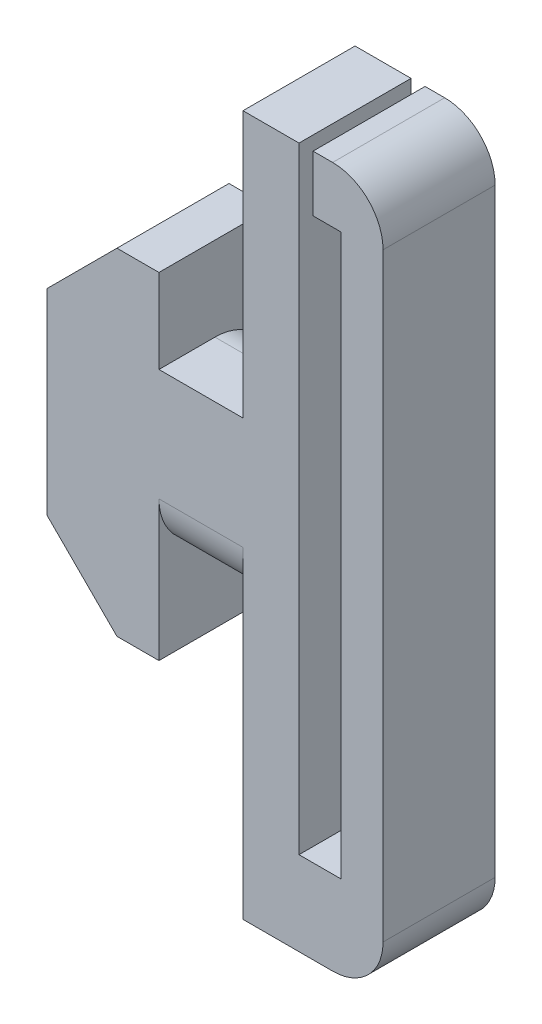
ISO-10303-21;
HEADER;
FILE_DESCRIPTION(('STEP AP214'),'2;1');
FILE_NAME('part.step','',(''),(''),'','','');
FILE_SCHEMA(('AUTOMOTIVE_DESIGN { 1 0 10303 214 1 1 1 1 }'));
ENDSEC;
DATA;
#1=APPLICATION_CONTEXT('core data for automotive mechanical design processes');
#2=APPLICATION_PROTOCOL_DEFINITION('international standard','automotive_design',2000,#1);
#3=PRODUCT_CONTEXT('',#1,'mechanical');
#4=PRODUCT('Part','Part','',(#3));
#5=PRODUCT_RELATED_PRODUCT_CATEGORY('part','',(#4));
#6=PRODUCT_DEFINITION_FORMATION('','',#4);
#7=PRODUCT_DEFINITION_CONTEXT('part definition',#1,'design');
#8=PRODUCT_DEFINITION('design','',#6,#7);
#9=PRODUCT_DEFINITION_SHAPE('','',#8);
#10=(LENGTH_UNIT() NAMED_UNIT(*) SI_UNIT(.MILLI.,.METRE.));
#11=(NAMED_UNIT(*) PLANE_ANGLE_UNIT() SI_UNIT($,.RADIAN.));
#12=(NAMED_UNIT(*) SI_UNIT($,.STERADIAN.) SOLID_ANGLE_UNIT());
#13=UNCERTAINTY_MEASURE_WITH_UNIT(LENGTH_MEASURE(1.E-05),#10,'distance_accuracy_value','');
#14=(GEOMETRIC_REPRESENTATION_CONTEXT(3) GLOBAL_UNCERTAINTY_ASSIGNED_CONTEXT((#13)) GLOBAL_UNIT_ASSIGNED_CONTEXT((#10,
#11,#12)) REPRESENTATION_CONTEXT('',''));
#15=CARTESIAN_POINT('',(0.,0.,0.));
#16=DIRECTION('',(0.,0.,1.));
#17=DIRECTION('',(1.,0.,0.));
#18=AXIS2_PLACEMENT_3D('',#15,#16,#17);
#19=CARTESIAN_POINT('',(0.,0.,4.));
#20=DIRECTION('',(1.,0.,0.));
#21=DIRECTION('',(0.,0.,-1.));
#22=AXIS2_PLACEMENT_3D('',#19,#20,#21);
#23=PLANE('',#22);
#24=DIRECTION('',(0.,0.,1.));
#25=VECTOR('',#24,1.);
#26=CARTESIAN_POINT('',(0.,9.5,0.));
#27=LINE('',#26,#25);
#28=CARTESIAN_POINT('',(0.,9.5,0.));
#29=VERTEX_POINT('',#28);
#30=CARTESIAN_POINT('',(0.,9.5,2.));
#31=VERTEX_POINT('',#30);
#32=EDGE_CURVE('E255',#29,#31,#27,.T.);
#33=ORIENTED_EDGE('',*,*,#32,.F.);
#34=DIRECTION('',(0.,-1.,0.));
#35=VECTOR('',#34,1.);
#36=CARTESIAN_POINT('',(0.,0.,0.));
#37=LINE('',#36,#35);
#38=CARTESIAN_POINT('',(0.,0.,0.));
#39=VERTEX_POINT('',#38);
#40=EDGE_CURVE('E334',#29,#39,#37,.T.);
#41=ORIENTED_EDGE('',*,*,#40,.T.);
#42=DIRECTION('',(0.,0.,-1.));
#43=VECTOR('',#42,1.);
#44=CARTESIAN_POINT('',(0.,0.,4.));
#45=LINE('',#44,#43);
#46=CARTESIAN_POINT('',(0.,0.,4.));
#47=VERTEX_POINT('',#46);
#48=EDGE_CURVE('E305',#47,#39,#45,.T.);
#49=ORIENTED_EDGE('',*,*,#48,.F.);
#50=DIRECTION('',(0.,-1.,0.));
#51=VECTOR('',#50,1.);
#52=CARTESIAN_POINT('',(0.,0.,4.));
#53=LINE('',#52,#51);
#54=CARTESIAN_POINT('',(0.,11.5,4.));
#55=VERTEX_POINT('',#54);
#56=EDGE_CURVE('E300',#55,#47,#53,.T.);
#57=ORIENTED_EDGE('',*,*,#56,.F.);
#58=CARTESIAN_POINT('',(0.,11.5,2.));
#59=DIRECTION('',(1.,0.,0.));
#60=DIRECTION('',(0.,0.,-1.));
#61=AXIS2_PLACEMENT_3D('',#58,#59,#60);
#62=CIRCLE('',#61,2.);
#63=EDGE_CURVE('E415',#55,#31,#62,.T.);
#64=ORIENTED_EDGE('',*,*,#63,.T.);
#65=EDGE_LOOP('',(#33,#41,#49,#57,#64));
#66=FACE_BOUND('',#65,.T.);
#67=ADVANCED_FACE('F39',(#66),#23,.F.);
#68=CARTESIAN_POINT('',(5.,0.,4.));
#69=DIRECTION('',(0.,1.,0.));
#70=DIRECTION('',(0.,0.,1.));
#71=AXIS2_PLACEMENT_3D('',#68,#69,#70);
#72=PLANE('',#71);
#73=DIRECTION('',(1.,0.,0.));
#74=VECTOR('',#73,1.);
#75=CARTESIAN_POINT('',(5.,0.,0.));
#76=LINE('',#75,#74);
#77=CARTESIAN_POINT('',(3.2,0.,0.));
#78=VERTEX_POINT('',#77);
#79=EDGE_CURVE('E266',#39,#78,#76,.T.);
#80=ORIENTED_EDGE('',*,*,#79,.T.);
#81=DIRECTION('',(0.,0.,-1.));
#82=VECTOR('',#81,1.);
#83=CARTESIAN_POINT('',(3.2,0.,4.));
#84=LINE('',#83,#82);
#85=CARTESIAN_POINT('',(3.2,0.,4.));
#86=VERTEX_POINT('',#85);
#87=EDGE_CURVE('E391',#78,#86,#84,.F.);
#88=ORIENTED_EDGE('',*,*,#87,.T.);
#89=DIRECTION('',(1.,0.,0.));
#90=VECTOR('',#89,1.);
#91=CARTESIAN_POINT('',(5.,0.,4.));
#92=LINE('',#91,#90);
#93=EDGE_CURVE('E270',#47,#86,#92,.T.);
#94=ORIENTED_EDGE('',*,*,#93,.F.);
#95=ORIENTED_EDGE('',*,*,#48,.T.);
#96=EDGE_LOOP('',(#80,#88,#94,#95));
#97=FACE_BOUND('',#96,.T.);
#98=ADVANCED_FACE('F464',(#97),#72,.F.);
#99=CARTESIAN_POINT('',(5.,25.,4.));
#100=DIRECTION('',(-1.,0.,0.));
#101=DIRECTION('',(0.,-1.,0.));
#102=AXIS2_PLACEMENT_3D('',#99,#100,#101);
#103=PLANE('',#102);
#104=DIRECTION('',(0.,1.,0.));
#105=VECTOR('',#104,1.);
#106=CARTESIAN_POINT('',(5.,25.,0.));
#107=LINE('',#106,#105);
#108=CARTESIAN_POINT('',(5.,1.8,0.));
#109=VERTEX_POINT('',#108);
#110=CARTESIAN_POINT('',(5.,23.2,0.));
#111=VERTEX_POINT('',#110);
#112=EDGE_CURVE('E309',#109,#111,#107,.T.);
#113=ORIENTED_EDGE('',*,*,#112,.T.);
#114=DIRECTION('',(0.,0.,-1.));
#115=VECTOR('',#114,1.);
#116=CARTESIAN_POINT('',(5.,23.2,4.));
#117=LINE('',#116,#115);
#118=CARTESIAN_POINT('',(5.,23.2,4.));
#119=VERTEX_POINT('',#118);
#120=EDGE_CURVE('E382',#111,#119,#117,.F.);
#121=ORIENTED_EDGE('',*,*,#120,.T.);
#122=DIRECTION('',(0.,1.,0.));
#123=VECTOR('',#122,1.);
#124=CARTESIAN_POINT('',(5.,25.,4.));
#125=LINE('',#124,#123);
#126=CARTESIAN_POINT('',(5.,1.8,4.));
#127=VERTEX_POINT('',#126);
#128=EDGE_CURVE('E274',#127,#119,#125,.T.);
#129=ORIENTED_EDGE('',*,*,#128,.F.);
#130=DIRECTION('',(0.,0.,-1.));
#131=VECTOR('',#130,1.);
#132=CARTESIAN_POINT('',(5.,1.8,4.));
#133=LINE('',#132,#131);
#134=EDGE_CURVE('E378',#127,#109,#133,.T.);
#135=ORIENTED_EDGE('',*,*,#134,.T.);
#136=EDGE_LOOP('',(#113,#121,#129,#135));
#137=FACE_BOUND('',#136,.T.);
#138=ADVANCED_FACE('F472',(#137),#103,.F.);
#139=CARTESIAN_POINT('',(2.5,25.,4.));
#140=DIRECTION('',(0.,-1.,0.));
#141=DIRECTION('',(0.,0.,-1.));
#142=AXIS2_PLACEMENT_3D('',#139,#140,#141);
#143=PLANE('',#142);
#144=DIRECTION('',(-1.,0.,0.));
#145=VECTOR('',#144,1.);
#146=CARTESIAN_POINT('',(2.5,25.,4.));
#147=LINE('',#146,#145);
#148=CARTESIAN_POINT('',(3.2,25.,4.));
#149=VERTEX_POINT('',#148);
#150=CARTESIAN_POINT('',(2.5,25.,4.));
#151=VERTEX_POINT('',#150);
#152=EDGE_CURVE('E279',#149,#151,#147,.T.);
#153=ORIENTED_EDGE('',*,*,#152,.F.);
#154=DIRECTION('',(0.,0.,-1.));
#155=VECTOR('',#154,1.);
#156=CARTESIAN_POINT('',(3.2,25.,4.));
#157=LINE('',#156,#155);
#158=CARTESIAN_POINT('',(3.2,25.,0.));
#159=VERTEX_POINT('',#158);
#160=EDGE_CURVE('E368',#149,#159,#157,.T.);
#161=ORIENTED_EDGE('',*,*,#160,.T.);
#162=DIRECTION('',(-1.,0.,0.));
#163=VECTOR('',#162,1.);
#164=CARTESIAN_POINT('',(2.5,25.,0.));
#165=LINE('',#164,#163);
#166=CARTESIAN_POINT('',(2.5,25.,0.));
#167=VERTEX_POINT('',#166);
#168=EDGE_CURVE('E313',#159,#167,#165,.T.);
#169=ORIENTED_EDGE('',*,*,#168,.T.);
#170=DIRECTION('',(0.,0.,-1.));
#171=VECTOR('',#170,1.);
#172=CARTESIAN_POINT('',(2.5,25.,4.));
#173=LINE('',#172,#171);
#174=EDGE_CURVE('E364',#151,#167,#173,.T.);
#175=ORIENTED_EDGE('',*,*,#174,.F.);
#176=EDGE_LOOP('',(#153,#161,#169,#175));
#177=FACE_BOUND('',#176,.T.);
#178=ADVANCED_FACE('F481',(#177),#143,.F.);
#179=CARTESIAN_POINT('',(2.5,23.,4.));
#180=DIRECTION('',(1.,0.,0.));
#181=DIRECTION('',(0.,0.,-1.));
#182=AXIS2_PLACEMENT_3D('',#179,#180,#181);
#183=PLANE('',#182);
#184=DIRECTION('',(0.,-1.,0.));
#185=VECTOR('',#184,1.);
#186=CARTESIAN_POINT('',(2.5,23.,0.));
#187=LINE('',#186,#185);
#188=CARTESIAN_POINT('',(2.5,23.,0.));
#189=VERTEX_POINT('',#188);
#190=EDGE_CURVE('E316',#167,#189,#187,.T.);
#191=ORIENTED_EDGE('',*,*,#190,.T.);
#192=DIRECTION('',(0.,0.,-1.));
#193=VECTOR('',#192,1.);
#194=CARTESIAN_POINT('',(2.5,23.,4.));
#195=LINE('',#194,#193);
#196=CARTESIAN_POINT('',(2.5,23.,4.));
#197=VERTEX_POINT('',#196);
#198=EDGE_CURVE('E360',#197,#189,#195,.T.);
#199=ORIENTED_EDGE('',*,*,#198,.F.);
#200=DIRECTION('',(0.,-1.,0.));
#201=VECTOR('',#200,1.);
#202=CARTESIAN_POINT('',(2.5,23.,4.));
#203=LINE('',#202,#201);
#204=EDGE_CURVE('E282',#151,#197,#203,.T.);
#205=ORIENTED_EDGE('',*,*,#204,.F.);
#206=ORIENTED_EDGE('',*,*,#174,.T.);
#207=EDGE_LOOP('',(#191,#199,#205,#206));
#208=FACE_BOUND('',#207,.T.);
#209=ADVANCED_FACE('F487',(#208),#183,.F.);
#210=CARTESIAN_POINT('',(3.5,23.,4.));
#211=DIRECTION('',(0.,1.,0.));
#212=DIRECTION('',(0.,0.,1.));
#213=AXIS2_PLACEMENT_3D('',#210,#211,#212);
#214=PLANE('',#213);
#215=DIRECTION('',(1.,0.,0.));
#216=VECTOR('',#215,1.);
#217=CARTESIAN_POINT('',(3.5,23.,0.));
#218=LINE('',#217,#216);
#219=CARTESIAN_POINT('',(3.5,23.,0.));
#220=VERTEX_POINT('',#219);
#221=EDGE_CURVE('E319',#189,#220,#218,.T.);
#222=ORIENTED_EDGE('',*,*,#221,.T.);
#223=DIRECTION('',(0.,0.,-1.));
#224=VECTOR('',#223,1.);
#225=CARTESIAN_POINT('',(3.5,23.,4.));
#226=LINE('',#225,#224);
#227=CARTESIAN_POINT('',(3.5,23.,4.));
#228=VERTEX_POINT('',#227);
#229=EDGE_CURVE('E356',#228,#220,#226,.T.);
#230=ORIENTED_EDGE('',*,*,#229,.F.);
#231=DIRECTION('',(1.,0.,0.));
#232=VECTOR('',#231,1.);
#233=CARTESIAN_POINT('',(3.5,23.,4.));
#234=LINE('',#233,#232);
#235=EDGE_CURVE('E285',#197,#228,#234,.T.);
#236=ORIENTED_EDGE('',*,*,#235,.F.);
#237=ORIENTED_EDGE('',*,*,#198,.T.);
#238=EDGE_LOOP('',(#222,#230,#236,#237));
#239=FACE_BOUND('',#238,.T.);
#240=ADVANCED_FACE('F493',(#239),#214,.F.);
#241=CARTESIAN_POINT('',(3.5,3.,4.));
#242=DIRECTION('',(1.,0.,0.));
#243=DIRECTION('',(0.,0.,-1.));
#244=AXIS2_PLACEMENT_3D('',#241,#242,#243);
#245=PLANE('',#244);
#246=DIRECTION('',(0.,-1.,0.));
#247=VECTOR('',#246,1.);
#248=CARTESIAN_POINT('',(3.5,3.,0.));
#249=LINE('',#248,#247);
#250=CARTESIAN_POINT('',(3.5,3.,0.));
#251=VERTEX_POINT('',#250);
#252=EDGE_CURVE('E322',#220,#251,#249,.T.);
#253=ORIENTED_EDGE('',*,*,#252,.T.);
#254=DIRECTION('',(0.,0.,-1.));
#255=VECTOR('',#254,1.);
#256=CARTESIAN_POINT('',(3.5,3.,4.));
#257=LINE('',#256,#255);
#258=CARTESIAN_POINT('',(3.5,3.,4.));
#259=VERTEX_POINT('',#258);
#260=EDGE_CURVE('E352',#259,#251,#257,.T.);
#261=ORIENTED_EDGE('',*,*,#260,.F.);
#262=DIRECTION('',(0.,-1.,0.));
#263=VECTOR('',#262,1.);
#264=CARTESIAN_POINT('',(3.5,3.,4.));
#265=LINE('',#264,#263);
#266=EDGE_CURVE('E288',#228,#259,#265,.T.);
#267=ORIENTED_EDGE('',*,*,#266,.F.);
#268=ORIENTED_EDGE('',*,*,#229,.T.);
#269=EDGE_LOOP('',(#253,#261,#267,#268));
#270=FACE_BOUND('',#269,.T.);
#271=ADVANCED_FACE('F497',(#270),#245,.F.);
#272=CARTESIAN_POINT('',(2.,3.,4.));
#273=DIRECTION('',(0.,-1.,0.));
#274=DIRECTION('',(0.,0.,-1.));
#275=AXIS2_PLACEMENT_3D('',#272,#273,#274);
#276=PLANE('',#275);
#277=DIRECTION('',(-1.,0.,0.));
#278=VECTOR('',#277,1.);
#279=CARTESIAN_POINT('',(2.,3.,0.));
#280=LINE('',#279,#278);
#281=CARTESIAN_POINT('',(2.,3.,0.));
#282=VERTEX_POINT('',#281);
#283=EDGE_CURVE('E325',#251,#282,#280,.T.);
#284=ORIENTED_EDGE('',*,*,#283,.T.);
#285=DIRECTION('',(0.,0.,-1.));
#286=VECTOR('',#285,1.);
#287=CARTESIAN_POINT('',(2.,3.,4.));
#288=LINE('',#287,#286);
#289=CARTESIAN_POINT('',(2.,3.,4.));
#290=VERTEX_POINT('',#289);
#291=EDGE_CURVE('E348',#290,#282,#288,.T.);
#292=ORIENTED_EDGE('',*,*,#291,.F.);
#293=DIRECTION('',(-1.,0.,0.));
#294=VECTOR('',#293,1.);
#295=CARTESIAN_POINT('',(2.,3.,4.));
#296=LINE('',#295,#294);
#297=EDGE_CURVE('E291',#259,#290,#296,.T.);
#298=ORIENTED_EDGE('',*,*,#297,.F.);
#299=ORIENTED_EDGE('',*,*,#260,.T.);
#300=EDGE_LOOP('',(#284,#292,#298,#299));
#301=FACE_BOUND('',#300,.T.);
#302=ADVANCED_FACE('F502',(#301),#276,.F.);
#303=CARTESIAN_POINT('',(2.,25.,4.));
#304=DIRECTION('',(-1.,0.,0.));
#305=DIRECTION('',(0.,-1.,0.));
#306=AXIS2_PLACEMENT_3D('',#303,#304,#305);
#307=PLANE('',#306);
#308=DIRECTION('',(0.,1.,0.));
#309=VECTOR('',#308,1.);
#310=CARTESIAN_POINT('',(2.,25.,0.));
#311=LINE('',#310,#309);
#312=CARTESIAN_POINT('',(2.,25.,0.));
#313=VERTEX_POINT('',#312);
#314=EDGE_CURVE('E328',#282,#313,#311,.T.);
#315=ORIENTED_EDGE('',*,*,#314,.T.);
#316=DIRECTION('',(0.,0.,-1.));
#317=VECTOR('',#316,1.);
#318=CARTESIAN_POINT('',(2.,25.,4.));
#319=LINE('',#318,#317);
#320=CARTESIAN_POINT('',(2.,25.,4.));
#321=VERTEX_POINT('',#320);
#322=EDGE_CURVE('E344',#321,#313,#319,.T.);
#323=ORIENTED_EDGE('',*,*,#322,.F.);
#324=DIRECTION('',(0.,1.,0.));
#325=VECTOR('',#324,1.);
#326=CARTESIAN_POINT('',(2.,25.,4.));
#327=LINE('',#326,#325);
#328=EDGE_CURVE('E294',#290,#321,#327,.T.);
#329=ORIENTED_EDGE('',*,*,#328,.F.);
#330=ORIENTED_EDGE('',*,*,#291,.T.);
#331=EDGE_LOOP('',(#315,#323,#329,#330));
#332=FACE_BOUND('',#331,.T.);
#333=ADVANCED_FACE('F508',(#332),#307,.F.);
#334=CARTESIAN_POINT('',(0.,25.,4.));
#335=DIRECTION('',(0.,-1.,0.));
#336=DIRECTION('',(0.,0.,-1.));
#337=AXIS2_PLACEMENT_3D('',#334,#335,#336);
#338=PLANE('',#337);
#339=DIRECTION('',(-1.,0.,0.));
#340=VECTOR('',#339,1.);
#341=CARTESIAN_POINT('',(0.,25.,0.));
#342=LINE('',#341,#340);
#343=CARTESIAN_POINT('',(0.,25.,0.));
#344=VERTEX_POINT('',#343);
#345=EDGE_CURVE('E331',#313,#344,#342,.T.);
#346=ORIENTED_EDGE('',*,*,#345,.T.);
#347=DIRECTION('',(0.,0.,-1.));
#348=VECTOR('',#347,1.);
#349=CARTESIAN_POINT('',(0.,25.,4.));
#350=LINE('',#349,#348);
#351=CARTESIAN_POINT('',(0.,25.,4.));
#352=VERTEX_POINT('',#351);
#353=EDGE_CURVE('E340',#352,#344,#350,.T.);
#354=ORIENTED_EDGE('',*,*,#353,.F.);
#355=DIRECTION('',(-1.,0.,0.));
#356=VECTOR('',#355,1.);
#357=CARTESIAN_POINT('',(0.,25.,4.));
#358=LINE('',#357,#356);
#359=EDGE_CURVE('E297',#321,#352,#358,.T.);
#360=ORIENTED_EDGE('',*,*,#359,.F.);
#361=ORIENTED_EDGE('',*,*,#322,.T.);
#362=EDGE_LOOP('',(#346,#354,#360,#361));
#363=FACE_BOUND('',#362,.T.);
#364=ADVANCED_FACE('F512',(#363),#338,.F.);
#365=CARTESIAN_POINT('',(0.,13.5,0.));
#366=VERTEX_POINT('',#365);
#367=EDGE_CURVE('E275',#344,#366,#37,.T.);
#368=ORIENTED_EDGE('',*,*,#367,.T.);
#369=CARTESIAN_POINT('',(0.,13.5,2.));
#370=DIRECTION('',(1.,0.,0.));
#371=DIRECTION('',(0.,0.,-1.));
#372=AXIS2_PLACEMENT_3D('',#369,#370,#371);
#373=CIRCLE('',#372,2.);
#374=CARTESIAN_POINT('',(0.,15.5,2.));
#375=VERTEX_POINT('',#374);
#376=EDGE_CURVE('E418',#366,#375,#373,.T.);
#377=ORIENTED_EDGE('',*,*,#376,.T.);
#378=DIRECTION('',(0.,0.,1.));
#379=VECTOR('',#378,1.);
#380=CARTESIAN_POINT('',(0.,15.5,0.));
#381=LINE('',#380,#379);
#382=CARTESIAN_POINT('',(0.,15.5,4.));
#383=VERTEX_POINT('',#382);
#384=EDGE_CURVE('E207',#375,#383,#381,.T.);
#385=ORIENTED_EDGE('',*,*,#384,.T.);
#386=EDGE_CURVE('E301',#352,#383,#53,.T.);
#387=ORIENTED_EDGE('',*,*,#386,.F.);
#388=ORIENTED_EDGE('',*,*,#353,.T.);
#389=EDGE_LOOP('',(#368,#377,#385,#387,#388));
#390=FACE_BOUND('',#389,.T.);
#391=ADVANCED_FACE('F516',(#390),#23,.F.);
#392=CARTESIAN_POINT('',(0.,0.,4.));
#393=DIRECTION('',(0.,0.,-1.));
#394=DIRECTION('',(-1.,0.,0.));
#395=AXIS2_PLACEMENT_3D('',#392,#393,#394);
#396=PLANE('',#395);
#397=DIRECTION('',(0.,1.,0.));
#398=VECTOR('',#397,1.);
#399=CARTESIAN_POINT('',(-7.,6.5,4.));
#400=LINE('',#399,#398);
#401=CARTESIAN_POINT('',(-7.,9.,4.));
#402=VERTEX_POINT('',#401);
#403=CARTESIAN_POINT('',(-7.,16.,4.));
#404=VERTEX_POINT('',#403);
#405=EDGE_CURVE('E246',#402,#404,#400,.T.);
#406=ORIENTED_EDGE('',*,*,#405,.F.);
#407=DIRECTION('',(-0.707106781186549,0.707106781186546,0.));
#408=VECTOR('',#407,1.);
#409=CARTESIAN_POINT('',(-7.,9.,4.));
#410=LINE('',#409,#408);
#411=CARTESIAN_POINT('',(-4.49999999999999,6.5,4.));
#412=VERTEX_POINT('',#411);
#413=EDGE_CURVE('E432',#402,#412,#410,.F.);
#414=ORIENTED_EDGE('',*,*,#413,.T.);
#415=DIRECTION('',(1.,0.,0.));
#416=VECTOR('',#415,1.);
#417=CARTESIAN_POINT('',(-7.,6.5,4.));
#418=LINE('',#417,#416);
#419=CARTESIAN_POINT('',(-3.,6.5,4.));
#420=VERTEX_POINT('',#419);
#421=EDGE_CURVE('E208',#412,#420,#418,.T.);
#422=ORIENTED_EDGE('',*,*,#421,.T.);
#423=DIRECTION('',(0.,1.,0.));
#424=VECTOR('',#423,1.);
#425=CARTESIAN_POINT('',(-3.,6.5,4.));
#426=LINE('',#425,#424);
#427=CARTESIAN_POINT('',(-3.,11.5,4.));
#428=VERTEX_POINT('',#427);
#429=EDGE_CURVE('E225',#420,#428,#426,.T.);
#430=ORIENTED_EDGE('',*,*,#429,.T.);
#431=DIRECTION('',(1.,0.,0.));
#432=VECTOR('',#431,1.);
#433=CARTESIAN_POINT('',(0.,11.5,4.));
#434=LINE('',#433,#432);
#435=EDGE_CURVE('E394',#428,#55,#434,.T.);
#436=ORIENTED_EDGE('',*,*,#435,.T.);
#437=ORIENTED_EDGE('',*,*,#56,.T.);
#438=ORIENTED_EDGE('',*,*,#93,.T.);
#439=CARTESIAN_POINT('',(3.2,1.8,4.));
#440=DIRECTION('',(0.,0.,-1.));
#441=DIRECTION('',(-1.,0.,0.));
#442=AXIS2_PLACEMENT_3D('',#439,#440,#441);
#443=CIRCLE('',#442,1.8);
#444=EDGE_CURVE('E385',#86,#127,#443,.F.);
#445=ORIENTED_EDGE('',*,*,#444,.T.);
#446=ORIENTED_EDGE('',*,*,#128,.T.);
#447=CARTESIAN_POINT('',(3.2,23.2,4.));
#448=DIRECTION('',(0.,0.,-1.));
#449=DIRECTION('',(-1.,0.,0.));
#450=AXIS2_PLACEMENT_3D('',#447,#448,#449);
#451=CIRCLE('',#450,1.8);
#452=EDGE_CURVE('E388',#119,#149,#451,.F.);
#453=ORIENTED_EDGE('',*,*,#452,.T.);
#454=ORIENTED_EDGE('',*,*,#152,.T.);
#455=ORIENTED_EDGE('',*,*,#204,.T.);
#456=ORIENTED_EDGE('',*,*,#235,.T.);
#457=ORIENTED_EDGE('',*,*,#266,.T.);
#458=ORIENTED_EDGE('',*,*,#297,.T.);
#459=ORIENTED_EDGE('',*,*,#328,.T.);
#460=ORIENTED_EDGE('',*,*,#359,.T.);
#461=ORIENTED_EDGE('',*,*,#386,.T.);
#462=DIRECTION('',(1.,0.,0.));
#463=VECTOR('',#462,1.);
#464=CARTESIAN_POINT('',(-3.,15.5,4.));
#465=LINE('',#464,#463);
#466=CARTESIAN_POINT('',(-3.,15.5,4.));
#467=VERTEX_POINT('',#466);
#468=EDGE_CURVE('E258',#467,#383,#465,.T.);
#469=ORIENTED_EDGE('',*,*,#468,.F.);
#470=CARTESIAN_POINT('',(-3.,18.5,4.));
#471=VERTEX_POINT('',#470);
#472=EDGE_CURVE('E227',#467,#471,#426,.T.);
#473=ORIENTED_EDGE('',*,*,#472,.T.);
#474=DIRECTION('',(1.,0.,0.));
#475=VECTOR('',#474,1.);
#476=CARTESIAN_POINT('',(-7.,18.5,4.));
#477=LINE('',#476,#475);
#478=CARTESIAN_POINT('',(-4.5,18.5,4.));
#479=VERTEX_POINT('',#478);
#480=EDGE_CURVE('E245',#479,#471,#477,.T.);
#481=ORIENTED_EDGE('',*,*,#480,.F.);
#482=DIRECTION('',(0.707106781186549,0.707106781186546,0.));
#483=VECTOR('',#482,1.);
#484=CARTESIAN_POINT('',(-7.,16.,4.));
#485=LINE('',#484,#483);
#486=EDGE_CURVE('E429',#479,#404,#485,.F.);
#487=ORIENTED_EDGE('',*,*,#486,.T.);
#488=EDGE_LOOP('',(#406,#414,#422,#430,#436,#437,#438,#445,#446,#453,#454,#455,#456,#457,#458,
#459,#460,#461,#469,#473,#481,#487));
#489=FACE_BOUND('',#488,.T.);
#490=ADVANCED_FACE('F451',(#489),#396,.F.);
#491=CARTESIAN_POINT('',(0.,0.,0.));
#492=DIRECTION('',(0.,0.,-1.));
#493=DIRECTION('',(-1.,0.,0.));
#494=AXIS2_PLACEMENT_3D('',#491,#492,#493);
#495=PLANE('',#494);
#496=DIRECTION('',(1.,0.,0.));
#497=VECTOR('',#496,1.);
#498=CARTESIAN_POINT('',(-7.,6.5,0.));
#499=LINE('',#498,#497);
#500=CARTESIAN_POINT('',(-4.49999999999999,6.5,0.));
#501=VERTEX_POINT('',#500);
#502=CARTESIAN_POINT('',(-3.,6.5,0.));
#503=VERTEX_POINT('',#502);
#504=EDGE_CURVE('E199',#501,#503,#499,.T.);
#505=ORIENTED_EDGE('',*,*,#504,.F.);
#506=DIRECTION('',(0.707106781186549,-0.707106781186546,0.));
#507=VECTOR('',#506,1.);
#508=CARTESIAN_POINT('',(1.00000000000002,1.00000000000002,0.));
#509=LINE('',#508,#507);
#510=CARTESIAN_POINT('',(-7.,9.,0.));
#511=VERTEX_POINT('',#510);
#512=EDGE_CURVE('E48',#501,#511,#509,.F.);
#513=ORIENTED_EDGE('',*,*,#512,.T.);
#514=DIRECTION('',(0.,-1.,0.));
#515=VECTOR('',#514,1.);
#516=CARTESIAN_POINT('',(-7.,6.5,0.));
#517=LINE('',#516,#515);
#518=CARTESIAN_POINT('',(-7.,16.,0.));
#519=VERTEX_POINT('',#518);
#520=EDGE_CURVE('E241',#519,#511,#517,.T.);
#521=ORIENTED_EDGE('',*,*,#520,.F.);
#522=DIRECTION('',(-0.707106781186549,-0.707106781186546,0.));
#523=VECTOR('',#522,1.);
#524=CARTESIAN_POINT('',(-11.5,11.5,0.));
#525=LINE('',#524,#523);
#526=CARTESIAN_POINT('',(-4.5,18.5,0.));
#527=VERTEX_POINT('',#526);
#528=EDGE_CURVE('E55',#519,#527,#525,.F.);
#529=ORIENTED_EDGE('',*,*,#528,.T.);
#530=DIRECTION('',(1.,0.,0.));
#531=VECTOR('',#530,1.);
#532=CARTESIAN_POINT('',(-7.,18.5,0.));
#533=LINE('',#532,#531);
#534=CARTESIAN_POINT('',(-3.,18.5,0.));
#535=VERTEX_POINT('',#534);
#536=EDGE_CURVE('E242',#527,#535,#533,.T.);
#537=ORIENTED_EDGE('',*,*,#536,.T.);
#538=DIRECTION('',(0.,-1.,0.));
#539=VECTOR('',#538,1.);
#540=CARTESIAN_POINT('',(-3.,6.5,0.));
#541=LINE('',#540,#539);
#542=CARTESIAN_POINT('',(-3.,13.5,0.));
#543=VERTEX_POINT('',#542);
#544=EDGE_CURVE('E220',#535,#543,#541,.T.);
#545=ORIENTED_EDGE('',*,*,#544,.T.);
#546=DIRECTION('',(1.,0.,0.));
#547=VECTOR('',#546,1.);
#548=CARTESIAN_POINT('',(0.,13.5,0.));
#549=LINE('',#548,#547);
#550=EDGE_CURVE('E408',#543,#366,#549,.T.);
#551=ORIENTED_EDGE('',*,*,#550,.T.);
#552=ORIENTED_EDGE('',*,*,#367,.F.);
#553=ORIENTED_EDGE('',*,*,#345,.F.);
#554=ORIENTED_EDGE('',*,*,#314,.F.);
#555=ORIENTED_EDGE('',*,*,#283,.F.);
#556=ORIENTED_EDGE('',*,*,#252,.F.);
#557=ORIENTED_EDGE('',*,*,#221,.F.);
#558=ORIENTED_EDGE('',*,*,#190,.F.);
#559=ORIENTED_EDGE('',*,*,#168,.F.);
#560=CARTESIAN_POINT('',(3.2,23.2,0.));
#561=DIRECTION('',(0.,0.,-1.));
#562=DIRECTION('',(-1.,0.,0.));
#563=AXIS2_PLACEMENT_3D('',#560,#561,#562);
#564=CIRCLE('',#563,1.8);
#565=EDGE_CURVE('E375',#159,#111,#564,.T.);
#566=ORIENTED_EDGE('',*,*,#565,.T.);
#567=ORIENTED_EDGE('',*,*,#112,.F.);
#568=CARTESIAN_POINT('',(3.2,1.8,0.));
#569=DIRECTION('',(0.,0.,-1.));
#570=DIRECTION('',(-1.,0.,0.));
#571=AXIS2_PLACEMENT_3D('',#568,#569,#570);
#572=CIRCLE('',#571,1.8);
#573=EDGE_CURVE('E372',#109,#78,#572,.T.);
#574=ORIENTED_EDGE('',*,*,#573,.T.);
#575=ORIENTED_EDGE('',*,*,#79,.F.);
#576=ORIENTED_EDGE('',*,*,#40,.F.);
#577=DIRECTION('',(1.,0.,0.));
#578=VECTOR('',#577,1.);
#579=CARTESIAN_POINT('',(-3.,9.5,0.));
#580=LINE('',#579,#578);
#581=CARTESIAN_POINT('',(-3.,9.5,0.));
#582=VERTEX_POINT('',#581);
#583=EDGE_CURVE('E215',#582,#29,#580,.T.);
#584=ORIENTED_EDGE('',*,*,#583,.F.);
#585=EDGE_CURVE('E211',#582,#503,#541,.T.);
#586=ORIENTED_EDGE('',*,*,#585,.T.);
#587=EDGE_LOOP('',(#505,#513,#521,#529,#537,#545,#551,#552,#553,#554,#555,#556,#557,#558,#559,
#566,#567,#574,#575,#576,#584,#586));
#588=FACE_BOUND('',#587,.T.);
#589=ADVANCED_FACE('F212',(#588),#495,.T.);
#590=CARTESIAN_POINT('',(3.2,23.2,4.));
#591=DIRECTION('',(0.,0.,-1.));
#592=DIRECTION('',(-1.,0.,0.));
#593=AXIS2_PLACEMENT_3D('',#590,#591,#592);
#594=CYLINDRICAL_SURFACE('',#593,1.8);
#595=ORIENTED_EDGE('',*,*,#452,.F.);
#596=ORIENTED_EDGE('',*,*,#120,.F.);
#597=ORIENTED_EDGE('',*,*,#565,.F.);
#598=ORIENTED_EDGE('',*,*,#160,.F.);
#599=EDGE_LOOP('',(#595,#596,#597,#598));
#600=FACE_BOUND('',#599,.T.);
#601=ADVANCED_FACE('F476',(#600),#594,.T.);
#602=CARTESIAN_POINT('',(3.2,1.8,4.));
#603=DIRECTION('',(0.,0.,-1.));
#604=DIRECTION('',(-1.,0.,0.));
#605=AXIS2_PLACEMENT_3D('',#602,#603,#604);
#606=CYLINDRICAL_SURFACE('',#605,1.8);
#607=ORIENTED_EDGE('',*,*,#444,.F.);
#608=ORIENTED_EDGE('',*,*,#87,.F.);
#609=ORIENTED_EDGE('',*,*,#573,.F.);
#610=ORIENTED_EDGE('',*,*,#134,.F.);
#611=EDGE_LOOP('',(#607,#608,#609,#610));
#612=FACE_BOUND('',#611,.T.);
#613=ADVANCED_FACE('F467',(#612),#606,.T.);
#614=CARTESIAN_POINT('',(-3.,9.5,0.));
#615=DIRECTION('',(0.,1.,0.));
#616=DIRECTION('',(0.,0.,1.));
#617=AXIS2_PLACEMENT_3D('',#614,#615,#616);
#618=PLANE('',#617);
#619=ORIENTED_EDGE('',*,*,#32,.T.);
#620=DIRECTION('',(1.,0.,0.));
#621=VECTOR('',#620,1.);
#622=CARTESIAN_POINT('',(-3.,9.5,2.));
#623=LINE('',#622,#621);
#624=CARTESIAN_POINT('',(-3.,9.5,2.));
#625=VERTEX_POINT('',#624);
#626=EDGE_CURVE('E398',#31,#625,#623,.F.);
#627=ORIENTED_EDGE('',*,*,#626,.T.);
#628=DIRECTION('',(0.,0.,1.));
#629=VECTOR('',#628,1.);
#630=CARTESIAN_POINT('',(-3.,9.5,0.));
#631=LINE('',#630,#629);
#632=EDGE_CURVE('E254',#582,#625,#631,.T.);
#633=ORIENTED_EDGE('',*,*,#632,.F.);
#634=ORIENTED_EDGE('',*,*,#583,.T.);
#635=EDGE_LOOP('',(#619,#627,#633,#634));
#636=FACE_BOUND('',#635,.T.);
#637=ADVANCED_FACE('F580',(#636),#618,.F.);
#638=CARTESIAN_POINT('',(-3.,15.5,0.));
#639=DIRECTION('',(0.,1.,0.));
#640=DIRECTION('',(0.,0.,1.));
#641=AXIS2_PLACEMENT_3D('',#638,#639,#640);
#642=PLANE('',#641);
#643=ORIENTED_EDGE('',*,*,#384,.F.);
#644=DIRECTION('',(1.,0.,0.));
#645=VECTOR('',#644,1.);
#646=CARTESIAN_POINT('',(-3.,15.5,2.));
#647=LINE('',#646,#645);
#648=CARTESIAN_POINT('',(-3.,15.5,2.));
#649=VERTEX_POINT('',#648);
#650=EDGE_CURVE('E412',#375,#649,#647,.F.);
#651=ORIENTED_EDGE('',*,*,#650,.T.);
#652=DIRECTION('',(0.,0.,1.));
#653=VECTOR('',#652,1.);
#654=CARTESIAN_POINT('',(-3.,15.5,0.));
#655=LINE('',#654,#653);
#656=EDGE_CURVE('E251',#649,#467,#655,.T.);
#657=ORIENTED_EDGE('',*,*,#656,.T.);
#658=ORIENTED_EDGE('',*,*,#468,.T.);
#659=EDGE_LOOP('',(#643,#651,#657,#658));
#660=FACE_BOUND('',#659,.T.);
#661=ADVANCED_FACE('F521',(#660),#642,.T.);
#662=CARTESIAN_POINT('',(0.,11.5,2.));
#663=DIRECTION('',(1.,0.,0.));
#664=DIRECTION('',(0.,0.,-1.));
#665=AXIS2_PLACEMENT_3D('',#662,#663,#664);
#666=CYLINDRICAL_SURFACE('',#665,2.);
#667=CARTESIAN_POINT('',(-3.,11.5,2.));
#668=DIRECTION('',(1.,0.,0.));
#669=DIRECTION('',(0.,0.,-1.));
#670=AXIS2_PLACEMENT_3D('',#667,#668,#669);
#671=CIRCLE('',#670,2.);
#672=EDGE_CURVE('E405',#625,#428,#671,.F.);
#673=ORIENTED_EDGE('',*,*,#672,.F.);
#674=ORIENTED_EDGE('',*,*,#626,.F.);
#675=ORIENTED_EDGE('',*,*,#63,.F.);
#676=ORIENTED_EDGE('',*,*,#435,.F.);
#677=EDGE_LOOP('',(#673,#674,#675,#676));
#678=FACE_BOUND('',#677,.T.);
#679=ADVANCED_FACE('F537',(#678),#666,.T.);
#680=CARTESIAN_POINT('',(0.,13.5,2.));
#681=DIRECTION('',(1.,0.,0.));
#682=DIRECTION('',(0.,0.,-1.));
#683=AXIS2_PLACEMENT_3D('',#680,#681,#682);
#684=CYLINDRICAL_SURFACE('',#683,2.);
#685=CARTESIAN_POINT('',(-3.,13.5,2.));
#686=DIRECTION('',(1.,0.,0.));
#687=DIRECTION('',(0.,0.,-1.));
#688=AXIS2_PLACEMENT_3D('',#685,#686,#687);
#689=CIRCLE('',#688,2.);
#690=EDGE_CURVE('E401',#649,#543,#689,.F.);
#691=ORIENTED_EDGE('',*,*,#690,.F.);
#692=ORIENTED_EDGE('',*,*,#650,.F.);
#693=ORIENTED_EDGE('',*,*,#376,.F.);
#694=ORIENTED_EDGE('',*,*,#550,.F.);
#695=EDGE_LOOP('',(#691,#692,#693,#694));
#696=FACE_BOUND('',#695,.T.);
#697=ADVANCED_FACE('F535',(#696),#684,.T.);
#698=CARTESIAN_POINT('',(-3.,0.,0.));
#699=DIRECTION('',(1.,0.,0.));
#700=DIRECTION('',(0.,0.,-1.));
#701=AXIS2_PLACEMENT_3D('',#698,#699,#700);
#702=PLANE('',#701);
#703=ORIENTED_EDGE('',*,*,#656,.F.);
#704=ORIENTED_EDGE('',*,*,#690,.T.);
#705=ORIENTED_EDGE('',*,*,#544,.F.);
#706=DIRECTION('',(0.,0.,-1.));
#707=VECTOR('',#706,1.);
#708=CARTESIAN_POINT('',(-3.,18.5,0.));
#709=LINE('',#708,#707);
#710=EDGE_CURVE('E237',#471,#535,#709,.T.);
#711=ORIENTED_EDGE('',*,*,#710,.F.);
#712=ORIENTED_EDGE('',*,*,#472,.F.);
#713=EDGE_LOOP('',(#703,#704,#705,#711,#712));
#714=FACE_BOUND('',#713,.T.);
#715=ADVANCED_FACE('F526',(#714),#702,.T.);
#716=CARTESIAN_POINT('',(-7.,6.5,0.));
#717=DIRECTION('',(0.,1.,0.));
#718=DIRECTION('',(0.,0.,1.));
#719=AXIS2_PLACEMENT_3D('',#716,#717,#718);
#720=PLANE('',#719);
#721=ORIENTED_EDGE('',*,*,#421,.F.);
#722=DIRECTION('',(0.,0.,-1.));
#723=VECTOR('',#722,1.);
#724=CARTESIAN_POINT('',(-4.49999999999999,6.5,0.));
#725=LINE('',#724,#723);
#726=EDGE_CURVE('E63',#412,#501,#725,.T.);
#727=ORIENTED_EDGE('',*,*,#726,.T.);
#728=ORIENTED_EDGE('',*,*,#504,.T.);
#729=DIRECTION('',(0.,0.,1.));
#730=VECTOR('',#729,1.);
#731=CARTESIAN_POINT('',(-3.,6.5,0.));
#732=LINE('',#731,#730);
#733=EDGE_CURVE('E203',#503,#420,#732,.T.);
#734=ORIENTED_EDGE('',*,*,#733,.T.);
#735=EDGE_LOOP('',(#721,#727,#728,#734));
#736=FACE_BOUND('',#735,.T.);
#737=ADVANCED_FACE('F201',(#736),#720,.F.);
#738=CARTESIAN_POINT('',(-7.,18.5,0.));
#739=DIRECTION('',(0.,-1.,0.));
#740=DIRECTION('',(0.,0.,-1.));
#741=AXIS2_PLACEMENT_3D('',#738,#739,#740);
#742=PLANE('',#741);
#743=ORIENTED_EDGE('',*,*,#536,.F.);
#744=DIRECTION('',(0.,0.,1.));
#745=VECTOR('',#744,1.);
#746=CARTESIAN_POINT('',(-4.5,18.5,0.));
#747=LINE('',#746,#745);
#748=EDGE_CURVE('E11',#527,#479,#747,.T.);
#749=ORIENTED_EDGE('',*,*,#748,.T.);
#750=ORIENTED_EDGE('',*,*,#480,.T.);
#751=ORIENTED_EDGE('',*,*,#710,.T.);
#752=EDGE_LOOP('',(#743,#749,#750,#751));
#753=FACE_BOUND('',#752,.T.);
#754=ADVANCED_FACE('F532',(#753),#742,.F.);
#755=CARTESIAN_POINT('',(-7.,0.,0.));
#756=DIRECTION('',(1.,0.,0.));
#757=DIRECTION('',(0.,0.,-1.));
#758=AXIS2_PLACEMENT_3D('',#755,#756,#757);
#759=PLANE('',#758);
#760=ORIENTED_EDGE('',*,*,#520,.T.);
#761=DIRECTION('',(0.,0.,1.));
#762=VECTOR('',#761,1.);
#763=CARTESIAN_POINT('',(-7.,9.,0.));
#764=LINE('',#763,#762);
#765=EDGE_CURVE('E425',#511,#402,#764,.T.);
#766=ORIENTED_EDGE('',*,*,#765,.T.);
#767=ORIENTED_EDGE('',*,*,#405,.T.);
#768=DIRECTION('',(0.,0.,-1.));
#769=VECTOR('',#768,1.);
#770=CARTESIAN_POINT('',(-7.,16.,0.));
#771=LINE('',#770,#769);
#772=EDGE_CURVE('E421',#404,#519,#771,.T.);
#773=ORIENTED_EDGE('',*,*,#772,.T.);
#774=EDGE_LOOP('',(#760,#766,#767,#773));
#775=FACE_BOUND('',#774,.T.);
#776=ADVANCED_FACE('F443',(#775),#759,.F.);
#777=ORIENTED_EDGE('',*,*,#585,.F.);
#778=ORIENTED_EDGE('',*,*,#632,.T.);
#779=ORIENTED_EDGE('',*,*,#672,.T.);
#780=ORIENTED_EDGE('',*,*,#429,.F.);
#781=ORIENTED_EDGE('',*,*,#733,.F.);
#782=EDGE_LOOP('',(#777,#778,#779,#780,#781));
#783=FACE_BOUND('',#782,.T.);
#784=ADVANCED_FACE('F222',(#783),#702,.T.);
#785=CARTESIAN_POINT('',(-7.,9.,0.));
#786=DIRECTION('',(0.707106781186546,0.707106781186549,0.));
#787=DIRECTION('',(0.,0.,1.));
#788=AXIS2_PLACEMENT_3D('',#785,#786,#787);
#789=PLANE('',#788);
#790=ORIENTED_EDGE('',*,*,#512,.F.);
#791=ORIENTED_EDGE('',*,*,#726,.F.);
#792=ORIENTED_EDGE('',*,*,#413,.F.);
#793=ORIENTED_EDGE('',*,*,#765,.F.);
#794=EDGE_LOOP('',(#790,#791,#792,#793));
#795=FACE_BOUND('',#794,.T.);
#796=ADVANCED_FACE('F449',(#795),#789,.F.);
#797=CARTESIAN_POINT('',(-7.,16.,0.));
#798=DIRECTION('',(0.707106781186546,-0.707106781186549,0.));
#799=DIRECTION('',(0.,0.,-1.));
#800=AXIS2_PLACEMENT_3D('',#797,#798,#799);
#801=PLANE('',#800);
#802=ORIENTED_EDGE('',*,*,#486,.F.);
#803=ORIENTED_EDGE('',*,*,#748,.F.);
#804=ORIENTED_EDGE('',*,*,#528,.F.);
#805=ORIENTED_EDGE('',*,*,#772,.F.);
#806=EDGE_LOOP('',(#802,#803,#804,#805));
#807=FACE_BOUND('',#806,.T.);
#808=ADVANCED_FACE('F41',(#807),#801,.F.);
#809=CLOSED_SHELL('',(#67,#98,#138,#178,#209,#240,#271,#302,#333,#364,#391,#490,#589,#601,#613,
#637,#661,#679,#697,#715,#737,#754,#776,#784,#796,#808));
#810=MANIFOLD_SOLID_BREP('B2',#809);
#811=ADVANCED_BREP_SHAPE_REPRESENTATION('',(#18,#810),#14);
#812=SHAPE_DEFINITION_REPRESENTATION(#9,#811);
ENDSEC;
END-ISO-10303-21;
